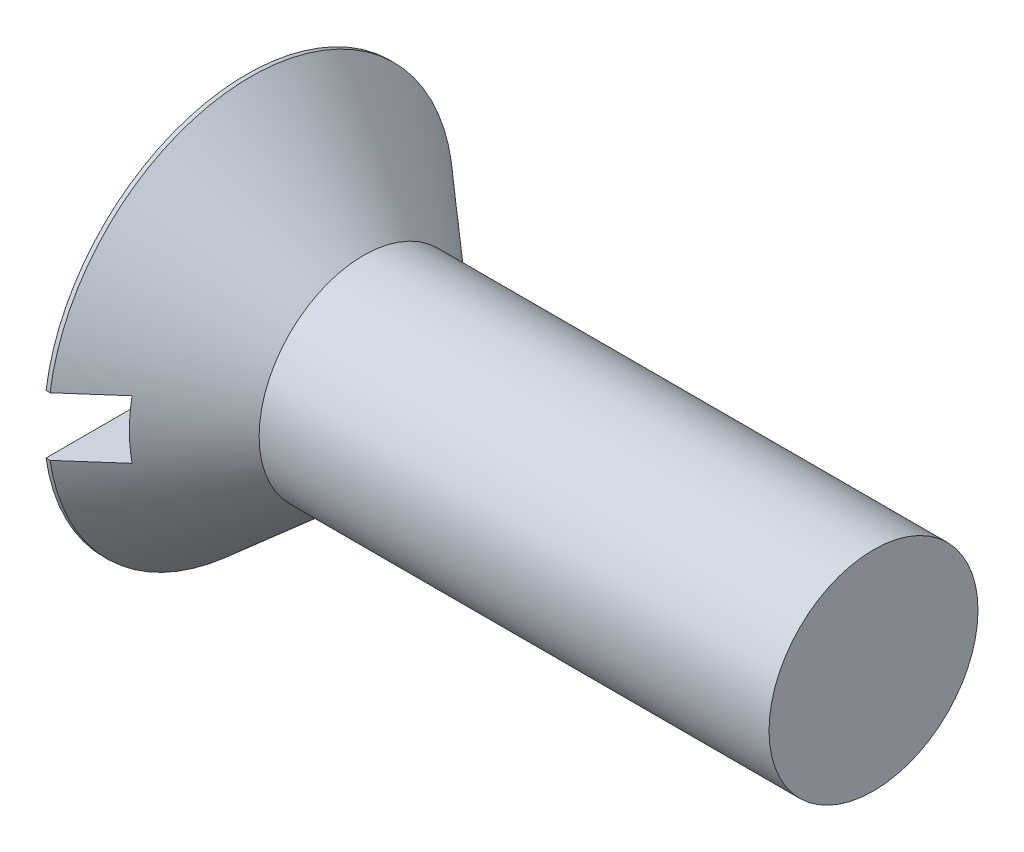
ISO-10303-21;
HEADER;
FILE_DESCRIPTION(('STEP AP214'),'2;1');
FILE_NAME('part.step','',(''),(''),'','','');
FILE_SCHEMA(('AUTOMOTIVE_DESIGN { 1 0 10303 214 1 1 1 1 }'));
ENDSEC;
DATA;
#1=APPLICATION_CONTEXT('core data for automotive mechanical design processes');
#2=APPLICATION_PROTOCOL_DEFINITION('international standard','automotive_design',2000,#1);
#3=PRODUCT_CONTEXT('',#1,'mechanical');
#4=PRODUCT('Part','Part','',(#3));
#5=PRODUCT_RELATED_PRODUCT_CATEGORY('part','',(#4));
#6=PRODUCT_DEFINITION_FORMATION('','',#4);
#7=PRODUCT_DEFINITION_CONTEXT('part definition',#1,'design');
#8=PRODUCT_DEFINITION('design','',#6,#7);
#9=PRODUCT_DEFINITION_SHAPE('','',#8);
#10=(LENGTH_UNIT() NAMED_UNIT(*) SI_UNIT(.MILLI.,.METRE.));
#11=(NAMED_UNIT(*) PLANE_ANGLE_UNIT() SI_UNIT($,.RADIAN.));
#12=(NAMED_UNIT(*) SI_UNIT($,.STERADIAN.) SOLID_ANGLE_UNIT());
#13=UNCERTAINTY_MEASURE_WITH_UNIT(LENGTH_MEASURE(1.E-05),#10,'distance_accuracy_value','');
#14=(GEOMETRIC_REPRESENTATION_CONTEXT(3) GLOBAL_UNCERTAINTY_ASSIGNED_CONTEXT((#13)) GLOBAL_UNIT_ASSIGNED_CONTEXT((#10,
#11,#12)) REPRESENTATION_CONTEXT('',''));
#15=CARTESIAN_POINT('',(0.,0.,0.));
#16=DIRECTION('',(0.,0.,1.));
#17=DIRECTION('',(1.,0.,0.));
#18=AXIS2_PLACEMENT_3D('',#15,#16,#17);
#19=CARTESIAN_POINT('',(0.,0.,0.));
#20=DIRECTION('',(-1.,0.,0.));
#21=DIRECTION('',(0.,0.,1.));
#22=AXIS2_PLACEMENT_3D('',#19,#20,#21);
#23=PLANE('',#22);
#24=DIRECTION('',(0.,0.,-1.));
#25=VECTOR('',#24,1.);
#26=CARTESIAN_POINT('',(0.,0.889000000000001,6.1595));
#27=LINE('',#26,#25);
#28=CARTESIAN_POINT('',(0.,0.889,6.09500773174243));
#29=VERTEX_POINT('',#28);
#30=CARTESIAN_POINT('',(0.,0.888999999999999,-6.09500773174243));
#31=VERTEX_POINT('',#30);
#32=EDGE_CURVE('E144',#29,#31,#27,.T.);
#33=ORIENTED_EDGE('',*,*,#32,.F.);
#34=CARTESIAN_POINT('',(0.,0.,0.));
#35=DIRECTION('',(-1.,0.,0.));
#36=DIRECTION('',(0.,0.,1.));
#37=AXIS2_PLACEMENT_3D('',#34,#35,#36);
#38=CIRCLE('',#37,6.1595);
#39=EDGE_CURVE('E99',#29,#31,#38,.T.);
#40=ORIENTED_EDGE('',*,*,#39,.T.);
#41=EDGE_LOOP('',(#33,#40));
#42=FACE_BOUND('',#41,.T.);
#43=ADVANCED_FACE('F33',(#42),#23,.T.);
#44=CARTESIAN_POINT('',(-6.34999999999999,0.,0.));
#45=DIRECTION('',(-1.,0.,0.));
#46=DIRECTION('',(0.,0.,1.));
#47=AXIS2_PLACEMENT_3D('',#44,#45,#46);
#48=CYLINDRICAL_SURFACE('',#47,6.1595);
#49=DIRECTION('',(-1.,0.,0.));
#50=VECTOR('',#49,1.);
#51=CARTESIAN_POINT('',(-6.34999999999999,0.888999999999999,-6.09500773174243));
#52=LINE('',#51,#50);
#53=CARTESIAN_POINT('',(0.122725488648909,0.888999999999999,-6.09500773174243));
#54=VERTEX_POINT('',#53);
#55=EDGE_CURVE('E61',#31,#54,#52,.F.);
#56=ORIENTED_EDGE('',*,*,#55,.F.);
#57=ORIENTED_EDGE('',*,*,#39,.F.);
#58=DIRECTION('',(-1.,0.,0.));
#59=VECTOR('',#58,1.);
#60=CARTESIAN_POINT('',(-6.34999999999999,0.889,6.09500773174243));
#61=LINE('',#60,#59);
#62=CARTESIAN_POINT('',(0.122725488648909,0.889000000000001,6.09500773174243));
#63=VERTEX_POINT('',#62);
#64=EDGE_CURVE('E147',#63,#29,#61,.T.);
#65=ORIENTED_EDGE('',*,*,#64,.F.);
#66=CARTESIAN_POINT('',(0.122725488648909,0.,0.));
#67=DIRECTION('',(-1.,0.,0.));
#68=DIRECTION('',(0.,0.,1.));
#69=AXIS2_PLACEMENT_3D('',#66,#67,#68);
#70=CIRCLE('',#69,6.1595);
#71=EDGE_CURVE('E110',#63,#54,#70,.T.);
#72=ORIENTED_EDGE('',*,*,#71,.T.);
#73=EDGE_LOOP('',(#56,#57,#65,#72));
#74=FACE_BOUND('',#73,.T.);
#75=ADVANCED_FACE('F146',(#74),#48,.T.);
#76=DIRECTION('',(0.,0.,1.));
#77=VECTOR('',#76,1.);
#78=CARTESIAN_POINT('',(0.,-0.889000000000001,-6.1595));
#79=LINE('',#78,#77);
#80=CARTESIAN_POINT('',(0.,-0.889000000000001,-6.09500773174243));
#81=VERTEX_POINT('',#80);
#82=CARTESIAN_POINT('',(0.,-0.889000000000001,6.09500773174243));
#83=VERTEX_POINT('',#82);
#84=EDGE_CURVE('E104',#81,#83,#79,.T.);
#85=ORIENTED_EDGE('',*,*,#84,.F.);
#86=EDGE_CURVE('E129',#81,#83,#38,.T.);
#87=ORIENTED_EDGE('',*,*,#86,.T.);
#88=EDGE_LOOP('',(#85,#87));
#89=FACE_BOUND('',#88,.T.);
#90=ADVANCED_FACE('F35',(#89),#23,.T.);
#91=DIRECTION('',(-1.,0.,0.));
#92=VECTOR('',#91,1.);
#93=CARTESIAN_POINT('',(-6.34999999999999,-0.889000000000001,6.09500773174243));
#94=LINE('',#93,#92);
#95=CARTESIAN_POINT('',(0.122725488648909,-0.889000000000001,6.09500773174243));
#96=VERTEX_POINT('',#95);
#97=EDGE_CURVE('E130',#83,#96,#94,.F.);
#98=ORIENTED_EDGE('',*,*,#97,.F.);
#99=ORIENTED_EDGE('',*,*,#86,.F.);
#100=DIRECTION('',(-1.,0.,0.));
#101=VECTOR('',#100,1.);
#102=CARTESIAN_POINT('',(-6.34999999999999,-0.889000000000001,-6.09500773174243));
#103=LINE('',#102,#101);
#104=CARTESIAN_POINT('',(0.122725488648909,-0.889000000000001,-6.09500773174243));
#105=VERTEX_POINT('',#104);
#106=EDGE_CURVE('E119',#105,#81,#103,.T.);
#107=ORIENTED_EDGE('',*,*,#106,.F.);
#108=EDGE_CURVE('E127',#105,#96,#70,.T.);
#109=ORIENTED_EDGE('',*,*,#108,.T.);
#110=EDGE_LOOP('',(#98,#99,#107,#109));
#111=FACE_BOUND('',#110,.T.);
#112=ADVANCED_FACE('F126',(#111),#48,.T.);
#113=CARTESIAN_POINT('',(0.122725488648909,0.,0.));
#114=DIRECTION('',(-1.,0.,0.));
#115=DIRECTION('',(0.,0.,1.));
#116=AXIS2_PLACEMENT_3D('',#113,#114,#115);
#117=CONICAL_SURFACE('',#116,6.1595,0.715584993317677);
#118=CARTESIAN_POINT('',(-7.31151043040796,0.888999999999998,-12.5906364427119));
#119=CARTESIAN_POINT('',(-6.81753149837582,0.888999999999999,-12.1601494532226));
#120=CARTESIAN_POINT('',(-6.32359882130326,0.888999999999999,-11.7296093316237));
#121=CARTESIAN_POINT('',(-5.33588058563866,0.888999999999999,-10.8683504567651));
#122=CARTESIAN_POINT('',(-4.8420950285593,0.888999999999999,-10.4376317017707));
#123=CARTESIAN_POINT('',(-3.85449582719149,0.888999999999999,-9.57574261416483));
#124=CARTESIAN_POINT('',(-3.36068228562492,0.888999999999999,-9.14457216383962));
#125=CARTESIAN_POINT('',(-2.37337914273823,0.888999999999999,-8.28186984611948));
#126=CARTESIAN_POINT('',(-1.87988953839065,0.888999999999999,-7.85033798219057));
#127=CARTESIAN_POINT('',(-0.923921841459331,0.888999999999999,-7.0133811402029));
#128=CARTESIAN_POINT('',(-0.461412750749005,0.888999999999999,-6.60799156879519));
#129=CARTESIAN_POINT('',(0.462860911440743,0.888999999999999,-5.79633808094841));
#130=CARTESIAN_POINT('',(0.924625462359873,0.888999999999999,-5.39007414106342));
#131=CARTESIAN_POINT('',(1.61608355843165,0.888999999999999,-4.77949574353229));
#132=CARTESIAN_POINT('',(1.84633089399188,0.888999999999999,-4.57580862119673));
#133=CARTESIAN_POINT('',(2.30627455206156,0.888999999999999,-4.16780827659465));
#134=CARTESIAN_POINT('',(2.53597086960947,0.888999999999999,-3.96349504872793));
#135=CARTESIAN_POINT('',(2.99449008257098,0.888999999999999,-3.55391273214838));
#136=CARTESIAN_POINT('',(3.22331301903337,0.888999999999999,-3.34864368939096));
#137=CARTESIAN_POINT('',(3.67953042426549,0.888999999999999,-2.93652532958522));
#138=CARTESIAN_POINT('',(3.90692492167919,0.889,-2.72967604441046));
#139=CARTESIAN_POINT('',(4.19329825648961,0.889,-2.46569930379462));
#140=CARTESIAN_POINT('',(4.25355456695227,0.889,-2.40995860737033));
#141=CARTESIAN_POINT('',(4.37381836236618,0.889,-2.29820980576881));
#142=CARTESIAN_POINT('',(4.43382584832826,0.889,-2.24220170167991));
#143=CARTESIAN_POINT('',(4.61344578151558,0.889,-2.0736460331092));
#144=CARTESIAN_POINT('',(4.73260439104827,0.889,-1.96061423559287));
#145=CARTESIAN_POINT('',(4.97098757412414,0.889,-1.73065477794563));
#146=CARTESIAN_POINT('',(5.09018012587742,0.889,-1.61369358378843));
#147=CARTESIAN_POINT('',(5.26621363187091,0.889,-1.43563516477463));
#148=CARTESIAN_POINT('',(5.32440463936624,0.889,-1.37587592600762));
#149=CARTESIAN_POINT('',(5.43949854168999,0.889,-1.25513002850696));
#150=CARTESIAN_POINT('',(5.49640152745383,0.889,-1.19414345700196));
#151=CARTESIAN_POINT('',(5.60911898215973,0.889,-1.06956933290217));
#152=CARTESIAN_POINT('',(5.66490623114929,0.889,-1.00595705172487));
#153=CARTESIAN_POINT('',(5.77343589755307,0.889,-0.876198030464183));
#154=CARTESIAN_POINT('',(5.82618025565965,0.889,-0.810052951557791));
#155=CARTESIAN_POINT('',(5.90104078130097,0.889,-0.708472290731803));
#156=CARTESIAN_POINT('',(5.9251163562183,0.889,-0.674487336312746));
#157=CARTESIAN_POINT('',(5.97156459611044,0.889,-0.605379483125493));
#158=CARTESIAN_POINT('',(5.99393789462862,0.889,-0.570257014717792));
#159=CARTESIAN_POINT('',(6.03629856665194,0.889,-0.498787684736802));
#160=CARTESIAN_POINT('',(6.05629562517632,0.889,-0.462446625857953));
#161=CARTESIAN_POINT('',(6.09314504520349,0.889,-0.388220404947528));
#162=CARTESIAN_POINT('',(6.11000134673368,0.889,-0.350337251180223));
#163=CARTESIAN_POINT('',(6.13331105143147,0.889,-0.289077773401494));
#164=CARTESIAN_POINT('',(6.14117153258342,0.889,-0.266238654408465));
#165=CARTESIAN_POINT('',(6.15519452166959,0.889,-0.220041591044936));
#166=CARTESIAN_POINT('',(6.16135666250767,0.889,-0.196683535683558));
#167=CARTESIAN_POINT('',(6.17686637254345,0.889,-0.12606225590315));
#168=CARTESIAN_POINT('',(6.18329926251414,0.889,-0.0780974512717798));
#169=CARTESIAN_POINT('',(6.18703461688254,0.889,0.0184537702274809));
#170=CARTESIAN_POINT('',(6.18428695246186,0.889,0.0670421520895294));
#171=CARTESIAN_POINT('',(6.17014853514273,0.889,0.163003334625176));
#172=CARTESIAN_POINT('',(6.15873564100236,0.889,0.210372699391016));
#173=CARTESIAN_POINT('',(6.13276109809224,0.889,0.291821488178843));
#174=CARTESIAN_POINT('',(6.11960186116897,0.889,0.326373655886872));
#175=CARTESIAN_POINT('',(6.09029458390121,0.889,0.394201582293508));
#176=CARTESIAN_POINT('',(6.07414436337464,0.889,0.427476388401993));
#177=CARTESIAN_POINT('',(6.0395227240665,0.889,0.492952340300211));
#178=CARTESIAN_POINT('',(6.02104200324834,0.889,0.525148489878801));
#179=CARTESIAN_POINT('',(5.98237220869668,0.889,0.588469874983954));
#180=CARTESIAN_POINT('',(5.9621838133122,0.889,0.619595528902379));
#181=CARTESIAN_POINT('',(5.8961176204824,0.889,0.716899551653335));
#182=CARTESIAN_POINT('',(5.8478420054498,0.889,0.78144156901803));
#183=CARTESIAN_POINT('',(5.7477506154296,0.889,0.907740722373645));
#184=CARTESIAN_POINT('',(5.69593140642682,0.889,0.969495057880027));
#185=CARTESIAN_POINT('',(5.5899257882447,0.889,1.09120453286482));
#186=CARTESIAN_POINT('',(5.53573369309567,0.889,1.15115469633921));
#187=CARTESIAN_POINT('',(5.42585006051589,0.889,1.26966673461868));
#188=CARTESIAN_POINT('',(5.37015834853114,0.889,1.32822844630435));
#189=CARTESIAN_POINT('',(5.25748323127301,0.889,1.44458407138188));
#190=CARTESIAN_POINT('',(5.2004952839863,0.889,1.50237357303499));
#191=CARTESIAN_POINT('',(5.08574505757675,0.889,1.61718773091339));
#192=CARTESIAN_POINT('',(5.02798270311785,0.889,1.67421231162998));
#193=CARTESIAN_POINT('',(4.9119857410796,0.889,1.78756823242782));
#194=CARTESIAN_POINT('',(4.85375217056311,0.889,1.84390063548012));
#195=CARTESIAN_POINT('',(4.73684362990091,0.889,1.9561006028999));
#196=CARTESIAN_POINT('',(4.67816867590618,0.889,2.01196818411997));
#197=CARTESIAN_POINT('',(4.50311103016756,0.889,2.1776183243649));
#198=CARTESIAN_POINT('',(4.38622788622288,0.889,2.28687175946658));
#199=CARTESIAN_POINT('',(4.15158118000607,0.889,2.50442984627599));
#200=CARTESIAN_POINT('',(4.03381760307984,0.889,2.61273448212628));
#201=CARTESIAN_POINT('',(3.67961455063303,0.889,2.9366773007784));
#202=CARTESIAN_POINT('',(3.44227622380513,0.889,3.15133179763573));
#203=CARTESIAN_POINT('',(2.96614674295652,0.889,3.57939864014281));
#204=CARTESIAN_POINT('',(2.727354586147,0.889,3.7928098658596));
#205=CARTESIAN_POINT('',(2.24900142557747,0.889,4.21875332816209));
#206=CARTESIAN_POINT('',(2.0094404466197,0.889,4.43128559260683));
#207=CARTESIAN_POINT('',(1.53101504935621,0.889,4.8547252689842));
#208=CARTESIAN_POINT('',(1.29215312073127,0.889,5.06563549673143));
#209=CARTESIAN_POINT('',(0.814085143200141,0.889,5.48706951585087));
#210=CARTESIAN_POINT('',(0.574879091440782,0.889000000000001,5.69759330398575));
#211=CARTESIAN_POINT('',(-0.142972947800626,0.889000000000001,6.32864353515917));
#212=CARTESIAN_POINT('',(-0.621978998138219,0.889000000000001,6.74876027829013));
#213=CARTESIAN_POINT('',(-1.61675615738177,0.889000000000001,7.62012341013692));
#214=CARTESIAN_POINT('',(-2.13256902407311,0.889000000000001,8.07132209196453));
#215=CARTESIAN_POINT('',(-3.16461476754477,0.889000000000001,8.97333236585136));
#216=CARTESIAN_POINT('',(-3.68084767788648,0.889000000000001,9.42414391950568));
#217=CARTESIAN_POINT('',(-4.71608092027282,0.889000000000001,10.3276984494218));
#218=CARTESIAN_POINT('',(-5.23508242880058,0.889000000000001,10.7804400774647));
#219=CARTESIAN_POINT('',(-6.27320939596535,0.889000000000001,11.6856858053579));
#220=CARTESIAN_POINT('',(-6.7923348390183,0.889000000000001,12.1381899230789));
#221=CARTESIAN_POINT('',(-7.31151043040796,0.889000000000001,12.5906364427119));
#222=B_SPLINE_CURVE_WITH_KNOTS('',3,(#118,#119,#120,#121,#122,#123,#124,#125,#126,#127,#128,
#129,#130,#131,#132,#133,#134,#135,#136,#137,#138,#139,#140,#141,#142,#143,#144,#145,#146,#147,
#148,#149,#150,#151,#152,#153,#154,#155,#156,#157,#158,#159,#160,#161,#162,#163,#164,#165,#166,
#167,#168,#169,#170,#171,#172,#173,#174,#175,#176,#177,#178,#179,#180,#181,#182,#183,#184,#185,
#186,#187,#188,#189,#190,#191,#192,#193,#194,#195,#196,#197,#198,#199,#200,#201,#202,#203,#204,
#205,#206,#207,#208,#209,#210,#211,#212,#213,#214,#215,#216,#217,#218,#219,#220,#221),
.UNSPECIFIED.,.F.,.F.,(4,2,2,2,2,2,2,2,2,2,2,2,2,2,2,2,2,2,2,2,2,2,2,2,2,2,2,2,2,2,2,2,2,2,2,2,
2,2,2,2,2,2,2,2,2,2,2,2,2,2,2,4),(0.,1.96570809414416,3.93143574634148,5.89811761953582,
7.8647808430566,9.70985457797865,11.5549784202422,12.4772145208841,13.3994588946785,
14.3216593757832,15.2438413049248,15.4900938281767,15.7363453500502,16.2290573866282,
16.7299840117202,16.9802042722764,17.2304068116184,17.4841889117495,17.7378073237163,
17.8627170460643,17.9875800504981,18.1119152891498,18.2360934854135,18.3084959927582,
18.3809141376476,18.5252565925599,18.6703884895139,18.8158924781866,18.9266558009301,
19.0375001811282,19.1488018906457,19.2600595929544,19.501606849194,19.7433915944927,
19.9857913462817,20.2282194361941,20.4716951861849,20.7151947964322,20.9582561584974,
21.2013086693769,21.6812804205511,22.1612601783296,23.1212750184917,24.0820511029793,
25.0427964982522,25.9987475323914,26.954706538646,28.8661195313931,30.9220347365566,
32.9781345881674,35.0442995668648,37.1102764607775),.UNSPECIFIED.);
#223=CARTESIAN_POINT('',(1.4478,0.888999999999999,-4.92808687302994));
#224=VERTEX_POINT('',#223);
#225=EDGE_CURVE('E11',#54,#224,#222,.T.);
#226=ORIENTED_EDGE('',*,*,#225,.F.);
#227=ORIENTED_EDGE('',*,*,#71,.F.);
#228=CARTESIAN_POINT('',(1.4478,0.889,4.92808687302994));
#229=VERTEX_POINT('',#228);
#230=EDGE_CURVE('E37',#229,#63,#222,.T.);
#231=ORIENTED_EDGE('',*,*,#230,.F.);
#232=CARTESIAN_POINT('',(1.4478,0.,0.));
#233=DIRECTION('',(-1.,0.,0.));
#234=DIRECTION('',(0.,0.,1.));
#235=AXIS2_PLACEMENT_3D('',#232,#233,#234);
#236=CIRCLE('',#235,5.00763030066418);
#237=CARTESIAN_POINT('',(1.4478,-0.889000000000001,4.92808687302994));
#238=VERTEX_POINT('',#237);
#239=EDGE_CURVE('E90',#229,#238,#236,.F.);
#240=ORIENTED_EDGE('',*,*,#239,.T.);
#241=CARTESIAN_POINT('',(-7.31151043040796,-0.889000000000001,12.5906364427119));
#242=CARTESIAN_POINT('',(-6.81753149837582,-0.889000000000001,12.1601494532226));
#243=CARTESIAN_POINT('',(-6.32359882130326,-0.889000000000001,11.7296093316237));
#244=CARTESIAN_POINT('',(-5.33588058563866,-0.889000000000001,10.8683504567651));
#245=CARTESIAN_POINT('',(-4.8420950285593,-0.889000000000001,10.4376317017707));
#246=CARTESIAN_POINT('',(-3.85449582719149,-0.889000000000001,9.57574261416483));
#247=CARTESIAN_POINT('',(-3.36068228562492,-0.889000000000001,9.14457216383962));
#248=CARTESIAN_POINT('',(-2.37337914273823,-0.889000000000001,8.28186984611948));
#249=CARTESIAN_POINT('',(-1.87988953839065,-0.889000000000001,7.85033798219057));
#250=CARTESIAN_POINT('',(-0.923921841459332,-0.889000000000001,7.0133811402029));
#251=CARTESIAN_POINT('',(-0.461412750749005,-0.889000000000001,6.60799156879519));
#252=CARTESIAN_POINT('',(0.462860911440743,-0.889000000000001,5.79633808094841));
#253=CARTESIAN_POINT('',(0.924625462359873,-0.889000000000001,5.39007414106342));
#254=CARTESIAN_POINT('',(1.61608355843165,-0.889000000000001,4.77949574353229));
#255=CARTESIAN_POINT('',(1.84633089399188,-0.889000000000001,4.57580862119673));
#256=CARTESIAN_POINT('',(2.30627455206156,-0.889000000000001,4.16780827659464));
#257=CARTESIAN_POINT('',(2.53597086960947,-0.889000000000001,3.96349504872793));
#258=CARTESIAN_POINT('',(2.99449008257098,-0.889000000000001,3.55391273214838));
#259=CARTESIAN_POINT('',(3.22331301903337,-0.889000000000001,3.34864368939095));
#260=CARTESIAN_POINT('',(3.67953042426549,-0.889000000000001,2.93652532958522));
#261=CARTESIAN_POINT('',(3.90692492167919,-0.889000000000001,2.72967604441046));
#262=CARTESIAN_POINT('',(4.19329825648961,-0.889000000000001,2.46569930379461));
#263=CARTESIAN_POINT('',(4.25355456695228,-0.889000000000001,2.40995860737033));
#264=CARTESIAN_POINT('',(4.37381836236618,-0.889000000000001,2.2982098057688));
#265=CARTESIAN_POINT('',(4.43382584832826,-0.889000000000001,2.2422017016799));
#266=CARTESIAN_POINT('',(4.61344578151559,-0.889000000000001,2.0736460331092));
#267=CARTESIAN_POINT('',(4.73260439104827,-0.889000000000001,1.96061423559287));
#268=CARTESIAN_POINT('',(4.97098757412414,-0.889000000000001,1.73065477794563));
#269=CARTESIAN_POINT('',(5.09018012587742,-0.889000000000001,1.61369358378843));
#270=CARTESIAN_POINT('',(5.26621363187091,-0.889000000000001,1.43563516477463));
#271=CARTESIAN_POINT('',(5.32440463936624,-0.889000000000001,1.37587592600762));
#272=CARTESIAN_POINT('',(5.43949854168999,-0.889000000000001,1.25513002850696));
#273=CARTESIAN_POINT('',(5.49640152745383,-0.889000000000001,1.19414345700195));
#274=CARTESIAN_POINT('',(5.60911898215973,-0.889000000000001,1.06956933290217));
#275=CARTESIAN_POINT('',(5.66490623114929,-0.889000000000001,1.00595705172487));
#276=CARTESIAN_POINT('',(5.77343589755307,-0.889000000000001,0.876198030464184));
#277=CARTESIAN_POINT('',(5.82618025565965,-0.889000000000001,0.81005295155779));
#278=CARTESIAN_POINT('',(5.90104078130097,-0.889000000000001,0.708472290731803));
#279=CARTESIAN_POINT('',(5.9251163562183,-0.889000000000001,0.674487336312745));
#280=CARTESIAN_POINT('',(5.97156459611044,-0.889000000000001,0.605379483125491));
#281=CARTESIAN_POINT('',(5.99393789462862,-0.889000000000001,0.570257014717789));
#282=CARTESIAN_POINT('',(6.03629856665194,-0.889000000000001,0.498787684736799));
#283=CARTESIAN_POINT('',(6.05629562517632,-0.889000000000001,0.462446625857951));
#284=CARTESIAN_POINT('',(6.09314504520349,-0.889000000000001,0.388220404947526));
#285=CARTESIAN_POINT('',(6.11000134673368,-0.889000000000001,0.350337251180221));
#286=CARTESIAN_POINT('',(6.13331105143147,-0.889000000000001,0.289077773401493));
#287=CARTESIAN_POINT('',(6.14117153258342,-0.889000000000001,0.266238654408465));
#288=CARTESIAN_POINT('',(6.15519452166959,-0.889000000000001,0.220041591044936));
#289=CARTESIAN_POINT('',(6.16135666250767,-0.889000000000001,0.196683535683557));
#290=CARTESIAN_POINT('',(6.17686637254345,-0.889000000000001,0.126062255903147));
#291=CARTESIAN_POINT('',(6.18329926251414,-0.889000000000001,0.0780974512717774));
#292=CARTESIAN_POINT('',(6.18703461688254,-0.889000000000001,-0.018453770227483));
#293=CARTESIAN_POINT('',(6.18428695246186,-0.889000000000001,-0.0670421520895315));
#294=CARTESIAN_POINT('',(6.17014853514273,-0.889000000000001,-0.163003334625178));
#295=CARTESIAN_POINT('',(6.15873564100235,-0.889000000000001,-0.210372699391018));
#296=CARTESIAN_POINT('',(6.13276109809223,-0.889000000000001,-0.291821488178846));
#297=CARTESIAN_POINT('',(6.11960186116896,-0.889000000000001,-0.326373655886877));
#298=CARTESIAN_POINT('',(6.09029458390121,-0.889000000000001,-0.394201582293513));
#299=CARTESIAN_POINT('',(6.07414436337463,-0.889000000000001,-0.427476388401997));
#300=CARTESIAN_POINT('',(6.0395227240665,-0.889000000000001,-0.492952340300214));
#301=CARTESIAN_POINT('',(6.02104200324834,-0.889000000000001,-0.525148489878804));
#302=CARTESIAN_POINT('',(5.98237220869668,-0.889000000000001,-0.588469874983956));
#303=CARTESIAN_POINT('',(5.9621838133122,-0.889000000000001,-0.619595528902382));
#304=CARTESIAN_POINT('',(5.8961176204824,-0.889000000000001,-0.716899551653339));
#305=CARTESIAN_POINT('',(5.8478420054498,-0.889000000000001,-0.781441569018034));
#306=CARTESIAN_POINT('',(5.7477506154296,-0.889000000000001,-0.907740722373649));
#307=CARTESIAN_POINT('',(5.69593140642682,-0.889000000000001,-0.96949505788003));
#308=CARTESIAN_POINT('',(5.58992578824469,-0.889000000000001,-1.09120453286483));
#309=CARTESIAN_POINT('',(5.53573369309567,-0.889000000000001,-1.15115469633921));
#310=CARTESIAN_POINT('',(5.42585006051589,-0.889000000000001,-1.26966673461868));
#311=CARTESIAN_POINT('',(5.37015834853113,-0.889000000000001,-1.32822844630435));
#312=CARTESIAN_POINT('',(5.257483231273,-0.889000000000001,-1.44458407138189));
#313=CARTESIAN_POINT('',(5.20049528398629,-0.889000000000001,-1.502373573035));
#314=CARTESIAN_POINT('',(5.08574505757674,-0.889000000000001,-1.61718773091339));
#315=CARTESIAN_POINT('',(5.02798270311784,-0.889000000000001,-1.67421231162999));
#316=CARTESIAN_POINT('',(4.91198574107959,-0.889000000000001,-1.78756823242783));
#317=CARTESIAN_POINT('',(4.8537521705631,-0.889000000000001,-1.84390063548013));
#318=CARTESIAN_POINT('',(4.73684362990089,-0.889000000000001,-1.95610060289991));
#319=CARTESIAN_POINT('',(4.67816867590616,-0.889000000000001,-2.01196818411999));
#320=CARTESIAN_POINT('',(4.50311103016754,-0.889000000000001,-2.17761832436491));
#321=CARTESIAN_POINT('',(4.38622788622287,-0.889000000000001,-2.28687175946659));
#322=CARTESIAN_POINT('',(4.15158118000605,-0.889000000000001,-2.50442984627601));
#323=CARTESIAN_POINT('',(4.03381760307982,-0.889000000000001,-2.6127344821263));
#324=CARTESIAN_POINT('',(3.679614550633,-0.889000000000001,-2.93667730077842));
#325=CARTESIAN_POINT('',(3.44227622380511,-0.889000000000001,-3.15133179763575));
#326=CARTESIAN_POINT('',(2.96614674295649,-0.889000000000001,-3.57939864014284));
#327=CARTESIAN_POINT('',(2.72735458614696,-0.889000000000001,-3.79280986585963));
#328=CARTESIAN_POINT('',(2.24900142557744,-0.889000000000001,-4.21875332816212));
#329=CARTESIAN_POINT('',(2.00944044661966,-0.889000000000001,-4.43128559260686));
#330=CARTESIAN_POINT('',(1.53101504935618,-0.889000000000001,-4.85472526898423));
#331=CARTESIAN_POINT('',(1.29215312073123,-0.889000000000001,-5.06563549673146));
#332=CARTESIAN_POINT('',(0.814085143200097,-0.889000000000001,-5.48706951585091));
#333=CARTESIAN_POINT('',(0.574879091440735,-0.889000000000001,-5.69759330398579));
#334=CARTESIAN_POINT('',(-0.14297294780068,-0.889000000000001,-6.32864353515921));
#335=CARTESIAN_POINT('',(-0.621978998138278,-0.889000000000001,-6.74876027829019));
#336=CARTESIAN_POINT('',(-1.61675615738183,-0.889000000000001,-7.62012341013697));
#337=CARTESIAN_POINT('',(-2.13256902407316,-0.889000000000001,-8.07132209196457));
#338=CARTESIAN_POINT('',(-3.16461476754481,-0.889000000000001,-8.9733323658514));
#339=CARTESIAN_POINT('',(-3.68084767788651,-0.889000000000001,-9.42414391950572));
#340=CARTESIAN_POINT('',(-4.71608092027284,-0.889000000000001,-10.3276984494219));
#341=CARTESIAN_POINT('',(-5.2350824288006,-0.889000000000001,-10.7804400774647));
#342=CARTESIAN_POINT('',(-6.27320939596536,-0.889000000000001,-11.6856858053579));
#343=CARTESIAN_POINT('',(-6.79233483901831,-0.889000000000001,-12.1381899230789));
#344=CARTESIAN_POINT('',(-7.31151043040796,-0.889000000000001,-12.5906364427119));
#345=B_SPLINE_CURVE_WITH_KNOTS('',3,(#241,#242,#243,#244,#245,#246,#247,#248,#249,#250,#251,
#252,#253,#254,#255,#256,#257,#258,#259,#260,#261,#262,#263,#264,#265,#266,#267,#268,#269,#270,
#271,#272,#273,#274,#275,#276,#277,#278,#279,#280,#281,#282,#283,#284,#285,#286,#287,#288,#289,
#290,#291,#292,#293,#294,#295,#296,#297,#298,#299,#300,#301,#302,#303,#304,#305,#306,#307,#308,
#309,#310,#311,#312,#313,#314,#315,#316,#317,#318,#319,#320,#321,#322,#323,#324,#325,#326,#327,
#328,#329,#330,#331,#332,#333,#334,#335,#336,#337,#338,#339,#340,#341,#342,#343,#344),
.UNSPECIFIED.,.F.,.F.,(4,2,2,2,2,2,2,2,2,2,2,2,2,2,2,2,2,2,2,2,2,2,2,2,2,2,2,2,2,2,2,2,2,2,2,2,
2,2,2,2,2,2,2,2,2,2,2,2,2,2,2,4),(0.,1.96570809414416,3.93143574634148,5.89811761953581,
7.8647808430566,9.70985457797864,11.5549784202422,12.4772145208841,13.3994588946785,
14.3216593757832,15.2438413049248,15.4900938281767,15.7363453500502,16.2290573866282,
16.7299840117202,16.9802042722764,17.2304068116184,17.4841889117495,17.7378073237163,
17.8627170460643,17.9875800504981,18.1119152891498,18.2360934854135,18.3084959927582,
18.3809141376476,18.5252565925599,18.6703884895139,18.8158924781866,18.9266558009301,
19.0375001811282,19.1488018906457,19.2600595929544,19.501606849194,19.7433915944927,
19.9857913462817,20.2282194361941,20.4716951861849,20.7151947964323,20.9582561584974,
21.201308669377,21.6812804205511,22.1612601783296,23.1212750184918,24.0820511029794,
25.0427964982523,25.9987475323914,26.9547065386461,28.8661195313932,30.9220347365567,
32.9781345881674,35.0442995668648,37.1102764607775),.UNSPECIFIED.);
#346=EDGE_CURVE('E98',#96,#238,#345,.T.);
#347=ORIENTED_EDGE('',*,*,#346,.F.);
#348=ORIENTED_EDGE('',*,*,#108,.F.);
#349=CARTESIAN_POINT('',(1.4478,-0.889000000000001,-4.92808687302994));
#350=VERTEX_POINT('',#349);
#351=EDGE_CURVE('E47',#350,#105,#345,.T.);
#352=ORIENTED_EDGE('',*,*,#351,.F.);
#353=EDGE_CURVE('E101',#350,#224,#236,.F.);
#354=ORIENTED_EDGE('',*,*,#353,.T.);
#355=EDGE_LOOP('',(#226,#227,#231,#240,#347,#348,#352,#354));
#356=FACE_BOUND('',#355,.T.);
#357=CARTESIAN_POINT('',(3.556,0.,0.));
#358=DIRECTION('',(-1.,0.,0.));
#359=DIRECTION('',(0.,0.,1.));
#360=AXIS2_PLACEMENT_3D('',#357,#358,#359);
#361=CIRCLE('',#360,3.175);
#362=CARTESIAN_POINT('',(3.556,0.,3.175));
#363=VERTEX_POINT('',#362);
#364=EDGE_CURVE('E132',#363,#363,#361,.T.);
#365=ORIENTED_EDGE('',*,*,#364,.T.);
#366=EDGE_LOOP('',(#365));
#367=FACE_BOUND('',#366,.T.);
#368=ADVANCED_FACE('F107',(#356,#367),#117,.T.);
#369=CARTESIAN_POINT('',(-6.34999999999999,0.,0.));
#370=DIRECTION('',(-1.,0.,0.));
#371=DIRECTION('',(0.,0.,1.));
#372=AXIS2_PLACEMENT_3D('',#369,#370,#371);
#373=CYLINDRICAL_SURFACE('',#372,3.175);
#374=CARTESIAN_POINT('',(19.05,0.,0.));
#375=DIRECTION('',(-1.,0.,0.));
#376=DIRECTION('',(0.,0.,1.));
#377=AXIS2_PLACEMENT_3D('',#374,#375,#376);
#378=CIRCLE('',#377,3.175);
#379=CARTESIAN_POINT('',(19.05,0.,3.175));
#380=VERTEX_POINT('',#379);
#381=EDGE_CURVE('E135',#380,#380,#378,.T.);
#382=ORIENTED_EDGE('',*,*,#381,.T.);
#383=EDGE_LOOP('',(#382));
#384=FACE_BOUND('',#383,.T.);
#385=ORIENTED_EDGE('',*,*,#364,.F.);
#386=EDGE_LOOP('',(#385));
#387=FACE_BOUND('',#386,.T.);
#388=ADVANCED_FACE('F188',(#384,#387),#373,.T.);
#389=CARTESIAN_POINT('',(19.05,3.175,0.));
#390=DIRECTION('',(1.,0.,0.));
#391=DIRECTION('',(0.,0.,-1.));
#392=AXIS2_PLACEMENT_3D('',#389,#390,#391);
#393=PLANE('',#392);
#394=ORIENTED_EDGE('',*,*,#381,.F.);
#395=EDGE_LOOP('',(#394));
#396=FACE_BOUND('',#395,.T.);
#397=ADVANCED_FACE('F198',(#396),#393,.T.);
#398=CARTESIAN_POINT('',(1.4478,0.889000000000001,6.1595));
#399=DIRECTION('',(0.,1.,0.));
#400=DIRECTION('',(0.,0.,1.));
#401=AXIS2_PLACEMENT_3D('',#398,#399,#400);
#402=PLANE('',#401);
#403=ORIENTED_EDGE('',*,*,#55,.T.);
#404=ORIENTED_EDGE('',*,*,#225,.T.);
#405=DIRECTION('',(0.,0.,-1.));
#406=VECTOR('',#405,1.);
#407=CARTESIAN_POINT('',(1.4478,0.889000000000001,6.1595));
#408=LINE('',#407,#406);
#409=EDGE_CURVE('E93',#229,#224,#408,.T.);
#410=ORIENTED_EDGE('',*,*,#409,.F.);
#411=ORIENTED_EDGE('',*,*,#230,.T.);
#412=ORIENTED_EDGE('',*,*,#64,.T.);
#413=ORIENTED_EDGE('',*,*,#32,.T.);
#414=EDGE_LOOP('',(#403,#404,#410,#411,#412,#413));
#415=FACE_BOUND('',#414,.T.);
#416=ADVANCED_FACE('F102',(#415),#402,.F.);
#417=CARTESIAN_POINT('',(1.4478,-0.889000000000001,-6.1595));
#418=DIRECTION('',(0.,-1.,0.));
#419=DIRECTION('',(0.,0.,-1.));
#420=AXIS2_PLACEMENT_3D('',#417,#418,#419);
#421=PLANE('',#420);
#422=ORIENTED_EDGE('',*,*,#97,.T.);
#423=ORIENTED_EDGE('',*,*,#346,.T.);
#424=DIRECTION('',(0.,0.,1.));
#425=VECTOR('',#424,1.);
#426=CARTESIAN_POINT('',(1.4478,-0.889000000000001,-6.1595));
#427=LINE('',#426,#425);
#428=EDGE_CURVE('E54',#350,#238,#427,.T.);
#429=ORIENTED_EDGE('',*,*,#428,.F.);
#430=ORIENTED_EDGE('',*,*,#351,.T.);
#431=ORIENTED_EDGE('',*,*,#106,.T.);
#432=ORIENTED_EDGE('',*,*,#84,.T.);
#433=EDGE_LOOP('',(#422,#423,#429,#430,#431,#432));
#434=FACE_BOUND('',#433,.T.);
#435=ADVANCED_FACE('F118',(#434),#421,.F.);
#436=CARTESIAN_POINT('',(1.4478,0.888999999999999,-6.1595));
#437=DIRECTION('',(-1.,0.,0.));
#438=DIRECTION('',(0.,0.,1.));
#439=AXIS2_PLACEMENT_3D('',#436,#437,#438);
#440=PLANE('',#439);
#441=ORIENTED_EDGE('',*,*,#428,.T.);
#442=ORIENTED_EDGE('',*,*,#239,.F.);
#443=ORIENTED_EDGE('',*,*,#409,.T.);
#444=ORIENTED_EDGE('',*,*,#353,.F.);
#445=EDGE_LOOP('',(#441,#442,#443,#444));
#446=FACE_BOUND('',#445,.T.);
#447=ADVANCED_FACE('F92',(#446),#440,.T.);
#448=CLOSED_SHELL('',(#43,#75,#90,#112,#368,#388,#397,#416,#435,#447));
#449=MANIFOLD_SOLID_BREP('B2',#448);
#450=ADVANCED_BREP_SHAPE_REPRESENTATION('',(#18,#449),#14);
#451=SHAPE_DEFINITION_REPRESENTATION(#9,#450);
ENDSEC;
END-ISO-10303-21;
